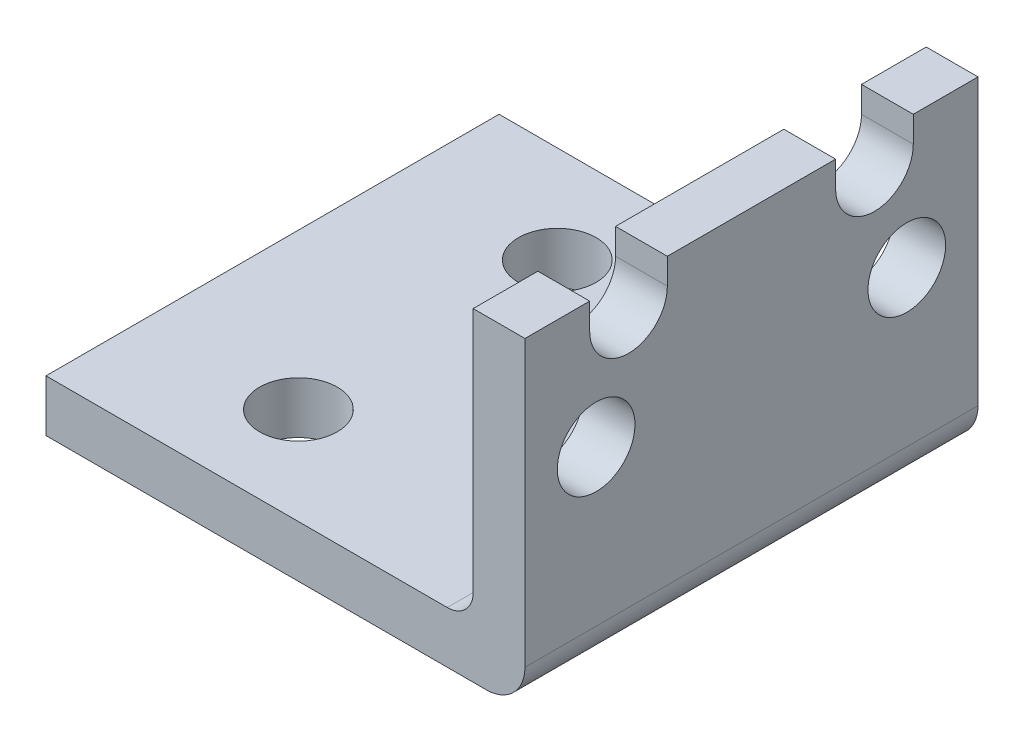
ISO-10303-21;
HEADER;
FILE_DESCRIPTION(('STEP AP214'),'2;1');
FILE_NAME('part.step','',(''),(''),'','','');
FILE_SCHEMA(('AUTOMOTIVE_DESIGN { 1 0 10303 214 1 1 1 1 }'));
ENDSEC;
DATA;
#1=APPLICATION_CONTEXT('core data for automotive mechanical design processes');
#2=APPLICATION_PROTOCOL_DEFINITION('international standard','automotive_design',2000,#1);
#3=PRODUCT_CONTEXT('',#1,'mechanical');
#4=PRODUCT('Part','Part','',(#3));
#5=PRODUCT_RELATED_PRODUCT_CATEGORY('part','',(#4));
#6=PRODUCT_DEFINITION_FORMATION('','',#4);
#7=PRODUCT_DEFINITION_CONTEXT('part definition',#1,'design');
#8=PRODUCT_DEFINITION('design','',#6,#7);
#9=PRODUCT_DEFINITION_SHAPE('','',#8);
#10=(LENGTH_UNIT() NAMED_UNIT(*) SI_UNIT(.MILLI.,.METRE.));
#11=(NAMED_UNIT(*) PLANE_ANGLE_UNIT() SI_UNIT($,.RADIAN.));
#12=(NAMED_UNIT(*) SI_UNIT($,.STERADIAN.) SOLID_ANGLE_UNIT());
#13=UNCERTAINTY_MEASURE_WITH_UNIT(LENGTH_MEASURE(1.E-05),#10,'distance_accuracy_value','');
#14=(GEOMETRIC_REPRESENTATION_CONTEXT(3) GLOBAL_UNCERTAINTY_ASSIGNED_CONTEXT((#13)) GLOBAL_UNIT_ASSIGNED_CONTEXT((#10,
#11,#12)) REPRESENTATION_CONTEXT('',''));
#15=CARTESIAN_POINT('',(0.,0.,0.));
#16=DIRECTION('',(0.,0.,1.));
#17=DIRECTION('',(1.,0.,0.));
#18=AXIS2_PLACEMENT_3D('',#15,#16,#17);
#19=CARTESIAN_POINT('',(11.4354193478474,-0.0792929292929359,35.));
#20=DIRECTION('',(0.,1.,0.));
#21=DIRECTION('',(0.,0.,1.));
#22=AXIS2_PLACEMENT_3D('',#19,#20,#21);
#23=PLANE('',#22);
#24=DIRECTION('',(-1.,0.,0.));
#25=VECTOR('',#24,1.);
#26=CARTESIAN_POINT('',(11.4354193478474,-0.0792929292929359,24.));
#27=LINE('',#26,#25);
#28=CARTESIAN_POINT('',(24.167628925166,-0.0792929292929359,24.));
#29=VERTEX_POINT('',#28);
#30=CARTESIAN_POINT('',(20.167628925166,-0.0792929292929359,24.));
#31=VERTEX_POINT('',#30);
#32=EDGE_CURVE('E194',#29,#31,#27,.T.);
#33=ORIENTED_EDGE('',*,*,#32,.F.);
#34=DIRECTION('',(0.,0.,-1.));
#35=VECTOR('',#34,1.);
#36=CARTESIAN_POINT('',(24.167628925166,-0.0792929292929359,35.));
#37=LINE('',#36,#35);
#38=CARTESIAN_POINT('',(24.167628925166,-0.0792929292929359,11.));
#39=VERTEX_POINT('',#38);
#40=EDGE_CURVE('E268',#29,#39,#37,.T.);
#41=ORIENTED_EDGE('',*,*,#40,.T.);
#42=DIRECTION('',(1.,0.,0.));
#43=VECTOR('',#42,1.);
#44=CARTESIAN_POINT('',(11.4354193478474,-0.0792929292929359,11.));
#45=LINE('',#44,#43);
#46=CARTESIAN_POINT('',(20.167628925166,-0.0792929292929359,11.));
#47=VERTEX_POINT('',#46);
#48=EDGE_CURVE('E196',#47,#39,#45,.T.);
#49=ORIENTED_EDGE('',*,*,#48,.F.);
#50=DIRECTION('',(0.,0.,-1.));
#51=VECTOR('',#50,1.);
#52=CARTESIAN_POINT('',(20.167628925166,-0.0792929292929359,35.));
#53=LINE('',#52,#51);
#54=EDGE_CURVE('E264',#31,#47,#53,.T.);
#55=ORIENTED_EDGE('',*,*,#54,.F.);
#56=EDGE_LOOP('',(#33,#41,#49,#55));
#57=FACE_BOUND('',#56,.T.);
#58=ADVANCED_FACE('F34',(#57),#23,.T.);
#59=DIRECTION('',(-1.,0.,0.));
#60=VECTOR('',#59,1.);
#61=CARTESIAN_POINT('',(11.4354193478474,-0.0792929292929359,5.));
#62=LINE('',#61,#60);
#63=CARTESIAN_POINT('',(24.167628925166,-0.0792929292929359,5.));
#64=VERTEX_POINT('',#63);
#65=CARTESIAN_POINT('',(20.167628925166,-0.0792929292929359,5.));
#66=VERTEX_POINT('',#65);
#67=EDGE_CURVE('E198',#64,#66,#62,.T.);
#68=ORIENTED_EDGE('',*,*,#67,.F.);
#69=CARTESIAN_POINT('',(24.167628925166,-0.0792929292929359,0.));
#70=VERTEX_POINT('',#69);
#71=EDGE_CURVE('E263',#64,#70,#37,.T.);
#72=ORIENTED_EDGE('',*,*,#71,.T.);
#73=DIRECTION('',(1.,0.,0.));
#74=VECTOR('',#73,1.);
#75=CARTESIAN_POINT('',(11.4354193478474,-0.0792929292929359,0.));
#76=LINE('',#75,#74);
#77=CARTESIAN_POINT('',(20.167628925166,-0.0792929292929359,0.));
#78=VERTEX_POINT('',#77);
#79=EDGE_CURVE('E253',#78,#70,#76,.T.);
#80=ORIENTED_EDGE('',*,*,#79,.F.);
#81=EDGE_CURVE('E259',#66,#78,#53,.T.);
#82=ORIENTED_EDGE('',*,*,#81,.F.);
#83=EDGE_LOOP('',(#68,#72,#80,#82));
#84=FACE_BOUND('',#83,.T.);
#85=ADVANCED_FACE('F317',(#84),#23,.T.);
#86=CARTESIAN_POINT('',(18.167628925166,-19.0792929292929,35.));
#87=DIRECTION('',(0.,0.,-1.));
#88=DIRECTION('',(-1.,0.,0.));
#89=AXIS2_PLACEMENT_3D('',#86,#87,#88);
#90=CYLINDRICAL_SURFACE('',#89,2.);
#91=CARTESIAN_POINT('',(18.167628925166,-19.0792929292929,0.));
#92=DIRECTION('',(0.,0.,1.));
#93=DIRECTION('',(1.,0.,0.));
#94=AXIS2_PLACEMENT_3D('',#91,#92,#93);
#95=CIRCLE('',#94,2.);
#96=CARTESIAN_POINT('',(18.167628925166,-21.0792929292929,0.));
#97=VERTEX_POINT('',#96);
#98=CARTESIAN_POINT('',(20.167628925166,-19.0792929292929,0.));
#99=VERTEX_POINT('',#98);
#100=EDGE_CURVE('E212',#97,#99,#95,.T.);
#101=ORIENTED_EDGE('',*,*,#100,.F.);
#102=DIRECTION('',(0.,0.,-1.));
#103=VECTOR('',#102,1.);
#104=CARTESIAN_POINT('',(18.167628925166,-21.0792929292929,35.));
#105=LINE('',#104,#103);
#106=CARTESIAN_POINT('',(18.167628925166,-21.0792929292929,35.));
#107=VERTEX_POINT('',#106);
#108=EDGE_CURVE('E276',#107,#97,#105,.T.);
#109=ORIENTED_EDGE('',*,*,#108,.F.);
#110=CARTESIAN_POINT('',(18.167628925166,-19.0792929292929,35.));
#111=DIRECTION('',(0.,0.,1.));
#112=DIRECTION('',(1.,0.,0.));
#113=AXIS2_PLACEMENT_3D('',#110,#111,#112);
#114=CIRCLE('',#113,2.);
#115=CARTESIAN_POINT('',(20.167628925166,-19.0792929292929,35.));
#116=VERTEX_POINT('',#115);
#117=EDGE_CURVE('E213',#107,#116,#114,.T.);
#118=ORIENTED_EDGE('',*,*,#117,.T.);
#119=DIRECTION('',(0.,0.,-1.));
#120=VECTOR('',#119,1.);
#121=CARTESIAN_POINT('',(20.167628925166,-19.0792929292929,35.));
#122=LINE('',#121,#120);
#123=EDGE_CURVE('E235',#116,#99,#122,.T.);
#124=ORIENTED_EDGE('',*,*,#123,.T.);
#125=EDGE_LOOP('',(#101,#109,#118,#124));
#126=FACE_BOUND('',#125,.T.);
#127=ADVANCED_FACE('F36',(#126),#90,.F.);
#128=CARTESIAN_POINT('',(11.4354193478474,-21.0792929292929,35.));
#129=DIRECTION('',(0.,-1.,0.));
#130=DIRECTION('',(1.,0.,0.));
#131=AXIS2_PLACEMENT_3D('',#128,#129,#130);
#132=PLANE('',#131);
#133=CARTESIAN_POINT('',(-0.832371074834004,-21.0792929292929,27.5));
#134=DIRECTION('',(0.,-1.,0.));
#135=DIRECTION('',(1.,0.,0.));
#136=AXIS2_PLACEMENT_3D('',#133,#134,#135);
#137=CIRCLE('',#136,3.);
#138=CARTESIAN_POINT('',(2.167628925166,-21.0792929292929,27.5));
#139=VERTEX_POINT('',#138);
#140=EDGE_CURVE('E203',#139,#139,#137,.T.);
#141=ORIENTED_EDGE('',*,*,#140,.T.);
#142=EDGE_LOOP('',(#141));
#143=FACE_BOUND('',#142,.T.);
#144=CARTESIAN_POINT('',(-0.832371074834001,-21.0792929292929,7.5));
#145=DIRECTION('',(0.,-1.,0.));
#146=DIRECTION('',(1.,0.,0.));
#147=AXIS2_PLACEMENT_3D('',#144,#145,#146);
#148=CIRCLE('',#147,3.);
#149=CARTESIAN_POINT('',(2.167628925166,-21.0792929292929,7.5));
#150=VERTEX_POINT('',#149);
#151=EDGE_CURVE('E209',#150,#150,#148,.T.);
#152=ORIENTED_EDGE('',*,*,#151,.T.);
#153=EDGE_LOOP('',(#152));
#154=FACE_BOUND('',#153,.T.);
#155=DIRECTION('',(-1.,0.,0.));
#156=VECTOR('',#155,1.);
#157=CARTESIAN_POINT('',(11.4354193478474,-21.0792929292929,0.));
#158=LINE('',#157,#156);
#159=CARTESIAN_POINT('',(-12.832371074834,-21.0792929292929,0.));
#160=VERTEX_POINT('',#159);
#161=EDGE_CURVE('E238',#97,#160,#158,.T.);
#162=ORIENTED_EDGE('',*,*,#161,.T.);
#163=DIRECTION('',(0.,0.,-1.));
#164=VECTOR('',#163,1.);
#165=CARTESIAN_POINT('',(-12.832371074834,-21.0792929292929,35.));
#166=LINE('',#165,#164);
#167=CARTESIAN_POINT('',(-12.832371074834,-21.0792929292929,35.));
#168=VERTEX_POINT('',#167);
#169=EDGE_CURVE('E274',#168,#160,#166,.T.);
#170=ORIENTED_EDGE('',*,*,#169,.F.);
#171=DIRECTION('',(-1.,0.,0.));
#172=VECTOR('',#171,1.);
#173=CARTESIAN_POINT('',(11.4354193478474,-21.0792929292929,35.));
#174=LINE('',#173,#172);
#175=EDGE_CURVE('E216',#107,#168,#174,.T.);
#176=ORIENTED_EDGE('',*,*,#175,.F.);
#177=ORIENTED_EDGE('',*,*,#108,.T.);
#178=EDGE_LOOP('',(#162,#170,#176,#177));
#179=FACE_BOUND('',#178,.T.);
#180=ADVANCED_FACE('F367',(#143,#154,#179),#132,.F.);
#181=CARTESIAN_POINT('',(-12.832371074834,-61.1764572046227,35.));
#182=DIRECTION('',(-1.,0.,0.));
#183=DIRECTION('',(0.,-1.,0.));
#184=AXIS2_PLACEMENT_3D('',#181,#182,#183);
#185=PLANE('',#184);
#186=DIRECTION('',(0.,1.,0.));
#187=VECTOR('',#186,1.);
#188=CARTESIAN_POINT('',(-12.832371074834,-61.1764572046227,0.));
#189=LINE('',#188,#187);
#190=CARTESIAN_POINT('',(-12.832371074834,-25.0792929292929,0.));
#191=VERTEX_POINT('',#190);
#192=EDGE_CURVE('E241',#191,#160,#189,.T.);
#193=ORIENTED_EDGE('',*,*,#192,.F.);
#194=DIRECTION('',(0.,0.,-1.));
#195=VECTOR('',#194,1.);
#196=CARTESIAN_POINT('',(-12.832371074834,-25.0792929292929,35.));
#197=LINE('',#196,#195);
#198=CARTESIAN_POINT('',(-12.832371074834,-25.0792929292929,35.));
#199=VERTEX_POINT('',#198);
#200=EDGE_CURVE('E272',#199,#191,#197,.T.);
#201=ORIENTED_EDGE('',*,*,#200,.F.);
#202=DIRECTION('',(0.,1.,0.));
#203=VECTOR('',#202,1.);
#204=CARTESIAN_POINT('',(-12.832371074834,-61.1764572046227,35.));
#205=LINE('',#204,#203);
#206=EDGE_CURVE('E219',#199,#168,#205,.T.);
#207=ORIENTED_EDGE('',*,*,#206,.T.);
#208=ORIENTED_EDGE('',*,*,#169,.T.);
#209=EDGE_LOOP('',(#193,#201,#207,#208));
#210=FACE_BOUND('',#209,.T.);
#211=ADVANCED_FACE('F364',(#210),#185,.T.);
#212=CARTESIAN_POINT('',(11.4354193478474,-25.0792929292929,35.));
#213=DIRECTION('',(0.,-1.,0.));
#214=DIRECTION('',(1.,0.,0.));
#215=AXIS2_PLACEMENT_3D('',#212,#213,#214);
#216=PLANE('',#215);
#217=CARTESIAN_POINT('',(-0.832371074834004,-25.0792929292929,27.5));
#218=DIRECTION('',(0.,-1.,0.));
#219=DIRECTION('',(1.,0.,0.));
#220=AXIS2_PLACEMENT_3D('',#217,#218,#219);
#221=CIRCLE('',#220,3.);
#222=CARTESIAN_POINT('',(2.167628925166,-25.0792929292929,27.5));
#223=VERTEX_POINT('',#222);
#224=EDGE_CURVE('E200',#223,#223,#221,.T.);
#225=ORIENTED_EDGE('',*,*,#224,.F.);
#226=EDGE_LOOP('',(#225));
#227=FACE_BOUND('',#226,.T.);
#228=CARTESIAN_POINT('',(-0.832371074834,-25.0792929292929,7.5));
#229=DIRECTION('',(0.,-1.,0.));
#230=DIRECTION('',(1.,0.,0.));
#231=AXIS2_PLACEMENT_3D('',#228,#229,#230);
#232=CIRCLE('',#231,3.);
#233=CARTESIAN_POINT('',(2.167628925166,-25.0792929292929,7.5));
#234=VERTEX_POINT('',#233);
#235=EDGE_CURVE('E206',#234,#234,#232,.T.);
#236=ORIENTED_EDGE('',*,*,#235,.F.);
#237=EDGE_LOOP('',(#236));
#238=FACE_BOUND('',#237,.T.);
#239=DIRECTION('',(-1.,0.,0.));
#240=VECTOR('',#239,1.);
#241=CARTESIAN_POINT('',(11.4354193478474,-25.0792929292929,0.));
#242=LINE('',#241,#240);
#243=CARTESIAN_POINT('',(21.167628925166,-25.0792929292929,0.));
#244=VERTEX_POINT('',#243);
#245=EDGE_CURVE('E244',#244,#191,#242,.T.);
#246=ORIENTED_EDGE('',*,*,#245,.F.);
#247=DIRECTION('',(0.,0.,-1.));
#248=VECTOR('',#247,1.);
#249=CARTESIAN_POINT('',(21.167628925166,-25.0792929292929,35.));
#250=LINE('',#249,#248);
#251=CARTESIAN_POINT('',(21.167628925166,-25.0792929292929,35.));
#252=VERTEX_POINT('',#251);
#253=EDGE_CURVE('E270',#252,#244,#250,.T.);
#254=ORIENTED_EDGE('',*,*,#253,.F.);
#255=DIRECTION('',(-1.,0.,0.));
#256=VECTOR('',#255,1.);
#257=CARTESIAN_POINT('',(11.4354193478474,-25.0792929292929,35.));
#258=LINE('',#257,#256);
#259=EDGE_CURVE('E222',#252,#199,#258,.T.);
#260=ORIENTED_EDGE('',*,*,#259,.T.);
#261=ORIENTED_EDGE('',*,*,#200,.T.);
#262=EDGE_LOOP('',(#246,#254,#260,#261));
#263=FACE_BOUND('',#262,.T.);
#264=ADVANCED_FACE('F359',(#227,#238,#263),#216,.T.);
#265=CARTESIAN_POINT('',(21.167628925166,-22.0792929292929,35.));
#266=DIRECTION('',(0.,0.,-1.));
#267=DIRECTION('',(-1.,0.,0.));
#268=AXIS2_PLACEMENT_3D('',#265,#266,#267);
#269=CYLINDRICAL_SURFACE('',#268,3.);
#270=CARTESIAN_POINT('',(21.167628925166,-22.0792929292929,0.));
#271=DIRECTION('',(0.,0.,1.));
#272=DIRECTION('',(1.,0.,0.));
#273=AXIS2_PLACEMENT_3D('',#270,#271,#272);
#274=CIRCLE('',#273,3.);
#275=CARTESIAN_POINT('',(24.167628925166,-22.0792929292929,0.));
#276=VERTEX_POINT('',#275);
#277=EDGE_CURVE('E247',#244,#276,#274,.T.);
#278=ORIENTED_EDGE('',*,*,#277,.T.);
#279=DIRECTION('',(0.,0.,-1.));
#280=VECTOR('',#279,1.);
#281=CARTESIAN_POINT('',(24.167628925166,-22.0792929292929,35.));
#282=LINE('',#281,#280);
#283=CARTESIAN_POINT('',(24.167628925166,-22.0792929292929,35.));
#284=VERTEX_POINT('',#283);
#285=EDGE_CURVE('E267',#284,#276,#282,.T.);
#286=ORIENTED_EDGE('',*,*,#285,.F.);
#287=CARTESIAN_POINT('',(21.167628925166,-22.0792929292929,35.));
#288=DIRECTION('',(0.,0.,1.));
#289=DIRECTION('',(1.,0.,0.));
#290=AXIS2_PLACEMENT_3D('',#287,#288,#289);
#291=CIRCLE('',#290,3.);
#292=EDGE_CURVE('E225',#252,#284,#291,.T.);
#293=ORIENTED_EDGE('',*,*,#292,.F.);
#294=ORIENTED_EDGE('',*,*,#253,.T.);
#295=EDGE_LOOP('',(#278,#286,#293,#294));
#296=FACE_BOUND('',#295,.T.);
#297=ADVANCED_FACE('F305',(#296),#269,.T.);
#298=CARTESIAN_POINT('',(24.167628925166,-61.1764572046227,35.));
#299=DIRECTION('',(1.,0.,0.));
#300=DIRECTION('',(0.,1.,0.));
#301=AXIS2_PLACEMENT_3D('',#298,#299,#300);
#302=PLANE('',#301);
#303=DIRECTION('',(0.,1.,0.));
#304=VECTOR('',#303,1.);
#305=CARTESIAN_POINT('',(24.167628925166,-2.07929292929293,24.));
#306=LINE('',#305,#304);
#307=CARTESIAN_POINT('',(24.167628925166,-2.07929292929293,24.));
#308=VERTEX_POINT('',#307);
#309=EDGE_CURVE('E154',#308,#29,#306,.T.);
#310=ORIENTED_EDGE('',*,*,#309,.F.);
#311=CARTESIAN_POINT('',(24.167628925166,-2.07929292929293,27.));
#312=DIRECTION('',(1.,0.,0.));
#313=DIRECTION('',(0.,1.,0.));
#314=AXIS2_PLACEMENT_3D('',#311,#312,#313);
#315=CIRCLE('',#314,3.);
#316=CARTESIAN_POINT('',(24.167628925166,-2.07929292929293,30.));
#317=VERTEX_POINT('',#316);
#318=EDGE_CURVE('E149',#317,#308,#315,.T.);
#319=ORIENTED_EDGE('',*,*,#318,.F.);
#320=DIRECTION('',(0.,-1.,0.));
#321=VECTOR('',#320,1.);
#322=CARTESIAN_POINT('',(24.167628925166,-2.07929292929293,30.));
#323=LINE('',#322,#321);
#324=CARTESIAN_POINT('',(24.167628925166,-0.0792929292929359,30.));
#325=VERTEX_POINT('',#324);
#326=EDGE_CURVE('E157',#325,#317,#323,.T.);
#327=ORIENTED_EDGE('',*,*,#326,.F.);
#328=CARTESIAN_POINT('',(24.167628925166,-0.0792929292929359,35.));
#329=VERTEX_POINT('',#328);
#330=EDGE_CURVE('E265',#329,#325,#37,.T.);
#331=ORIENTED_EDGE('',*,*,#330,.F.);
#332=DIRECTION('',(0.,-1.,0.));
#333=VECTOR('',#332,1.);
#334=CARTESIAN_POINT('',(24.167628925166,-61.1764572046227,35.));
#335=LINE('',#334,#333);
#336=EDGE_CURVE('E227',#329,#284,#335,.T.);
#337=ORIENTED_EDGE('',*,*,#336,.T.);
#338=ORIENTED_EDGE('',*,*,#285,.T.);
#339=DIRECTION('',(0.,-1.,0.));
#340=VECTOR('',#339,1.);
#341=CARTESIAN_POINT('',(24.167628925166,-61.1764572046227,0.));
#342=LINE('',#341,#340);
#343=EDGE_CURVE('E250',#70,#276,#342,.T.);
#344=ORIENTED_EDGE('',*,*,#343,.F.);
#345=ORIENTED_EDGE('',*,*,#71,.F.);
#346=DIRECTION('',(0.,1.,0.));
#347=VECTOR('',#346,1.);
#348=CARTESIAN_POINT('',(24.167628925166,-2.07929292929293,5.));
#349=LINE('',#348,#347);
#350=CARTESIAN_POINT('',(24.167628925166,-2.07929292929293,5.));
#351=VERTEX_POINT('',#350);
#352=EDGE_CURVE('E176',#351,#64,#349,.T.);
#353=ORIENTED_EDGE('',*,*,#352,.F.);
#354=CARTESIAN_POINT('',(24.167628925166,-2.07929292929293,8.));
#355=DIRECTION('',(1.,0.,0.));
#356=DIRECTION('',(0.,1.,0.));
#357=AXIS2_PLACEMENT_3D('',#354,#355,#356);
#358=CIRCLE('',#357,3.);
#359=CARTESIAN_POINT('',(24.167628925166,-2.07929292929293,11.));
#360=VERTEX_POINT('',#359);
#361=EDGE_CURVE('E173',#360,#351,#358,.T.);
#362=ORIENTED_EDGE('',*,*,#361,.F.);
#363=DIRECTION('',(0.,-1.,0.));
#364=VECTOR('',#363,1.);
#365=CARTESIAN_POINT('',(24.167628925166,-2.07929292929293,11.));
#366=LINE('',#365,#364);
#367=EDGE_CURVE('E170',#39,#360,#366,.T.);
#368=ORIENTED_EDGE('',*,*,#367,.F.);
#369=ORIENTED_EDGE('',*,*,#40,.F.);
#370=EDGE_LOOP('',(#310,#319,#327,#331,#337,#338,#344,#345,#353,#362,#368,#369));
#371=FACE_BOUND('',#370,.T.);
#372=CARTESIAN_POINT('',(24.167628925166,-10.0792929292929,29.5));
#373=DIRECTION('',(1.,0.,0.));
#374=DIRECTION('',(0.,1.,0.));
#375=AXIS2_PLACEMENT_3D('',#372,#373,#374);
#376=CIRCLE('',#375,3.);
#377=CARTESIAN_POINT('',(24.167628925166,-7.07929292929292,29.5));
#378=VERTEX_POINT('',#377);
#379=EDGE_CURVE('E180',#378,#378,#376,.T.);
#380=ORIENTED_EDGE('',*,*,#379,.F.);
#381=EDGE_LOOP('',(#380));
#382=FACE_BOUND('',#381,.T.);
#383=CARTESIAN_POINT('',(24.167628925166,-10.0792929292929,5.50000000000001));
#384=DIRECTION('',(1.,0.,0.));
#385=DIRECTION('',(0.,1.,0.));
#386=AXIS2_PLACEMENT_3D('',#383,#384,#385);
#387=CIRCLE('',#386,3.);
#388=CARTESIAN_POINT('',(24.167628925166,-7.07929292929292,5.50000000000001));
#389=VERTEX_POINT('',#388);
#390=EDGE_CURVE('E187',#389,#389,#387,.T.);
#391=ORIENTED_EDGE('',*,*,#390,.F.);
#392=EDGE_LOOP('',(#391));
#393=FACE_BOUND('',#392,.T.);
#394=ADVANCED_FACE('F164',(#371,#382,#393),#302,.T.);
#395=DIRECTION('',(1.,0.,0.));
#396=VECTOR('',#395,1.);
#397=CARTESIAN_POINT('',(11.4354193478474,-0.0792929292929359,30.));
#398=LINE('',#397,#396);
#399=CARTESIAN_POINT('',(20.167628925166,-0.0792929292929359,30.));
#400=VERTEX_POINT('',#399);
#401=EDGE_CURVE('E160',#400,#325,#398,.T.);
#402=ORIENTED_EDGE('',*,*,#401,.F.);
#403=CARTESIAN_POINT('',(20.167628925166,-0.0792929292929359,35.));
#404=VERTEX_POINT('',#403);
#405=EDGE_CURVE('E260',#404,#400,#53,.T.);
#406=ORIENTED_EDGE('',*,*,#405,.F.);
#407=DIRECTION('',(1.,0.,0.));
#408=VECTOR('',#407,1.);
#409=CARTESIAN_POINT('',(11.4354193478474,-0.0792929292929359,35.));
#410=LINE('',#409,#408);
#411=EDGE_CURVE('E230',#404,#329,#410,.T.);
#412=ORIENTED_EDGE('',*,*,#411,.T.);
#413=ORIENTED_EDGE('',*,*,#330,.T.);
#414=EDGE_LOOP('',(#402,#406,#412,#413));
#415=FACE_BOUND('',#414,.T.);
#416=ADVANCED_FACE('F294',(#415),#23,.T.);
#417=CARTESIAN_POINT('',(20.167628925166,-61.1764572046227,35.));
#418=DIRECTION('',(1.,0.,0.));
#419=DIRECTION('',(0.,1.,0.));
#420=AXIS2_PLACEMENT_3D('',#417,#418,#419);
#421=PLANE('',#420);
#422=CARTESIAN_POINT('',(20.167628925166,-10.0792929292929,29.5));
#423=DIRECTION('',(1.,0.,0.));
#424=DIRECTION('',(0.,1.,0.));
#425=AXIS2_PLACEMENT_3D('',#422,#423,#424);
#426=CIRCLE('',#425,3.);
#427=CARTESIAN_POINT('',(20.167628925166,-7.07929292929292,29.5));
#428=VERTEX_POINT('',#427);
#429=EDGE_CURVE('E184',#428,#428,#426,.T.);
#430=ORIENTED_EDGE('',*,*,#429,.T.);
#431=EDGE_LOOP('',(#430));
#432=FACE_BOUND('',#431,.T.);
#433=CARTESIAN_POINT('',(20.167628925166,-10.0792929292929,5.50000000000001));
#434=DIRECTION('',(1.,0.,0.));
#435=DIRECTION('',(0.,1.,0.));
#436=AXIS2_PLACEMENT_3D('',#433,#434,#435);
#437=CIRCLE('',#436,3.);
#438=CARTESIAN_POINT('',(20.167628925166,-7.07929292929292,5.50000000000001));
#439=VERTEX_POINT('',#438);
#440=EDGE_CURVE('E190',#439,#439,#437,.T.);
#441=ORIENTED_EDGE('',*,*,#440,.T.);
#442=EDGE_LOOP('',(#441));
#443=FACE_BOUND('',#442,.T.);
#444=CARTESIAN_POINT('',(20.167628925166,-2.07929292929294,27.));
#445=DIRECTION('',(1.,0.,0.));
#446=DIRECTION('',(0.,1.,0.));
#447=AXIS2_PLACEMENT_3D('',#444,#445,#446);
#448=CIRCLE('',#447,3.);
#449=CARTESIAN_POINT('',(20.167628925166,-2.07929292929295,30.));
#450=VERTEX_POINT('',#449);
#451=CARTESIAN_POINT('',(20.167628925166,-2.07929292929294,24.));
#452=VERTEX_POINT('',#451);
#453=EDGE_CURVE('E42',#450,#452,#448,.T.);
#454=ORIENTED_EDGE('',*,*,#453,.T.);
#455=DIRECTION('',(0.,1.,0.));
#456=VECTOR('',#455,1.);
#457=CARTESIAN_POINT('',(20.167628925166,-61.1764572046227,24.));
#458=LINE('',#457,#456);
#459=EDGE_CURVE('E11',#452,#31,#458,.T.);
#460=ORIENTED_EDGE('',*,*,#459,.T.);
#461=ORIENTED_EDGE('',*,*,#54,.T.);
#462=DIRECTION('',(0.,-1.,0.));
#463=VECTOR('',#462,1.);
#464=CARTESIAN_POINT('',(20.167628925166,-61.1764572046227,11.));
#465=LINE('',#464,#463);
#466=CARTESIAN_POINT('',(20.167628925166,-2.07929292929295,11.));
#467=VERTEX_POINT('',#466);
#468=EDGE_CURVE('E278',#47,#467,#465,.T.);
#469=ORIENTED_EDGE('',*,*,#468,.T.);
#470=CARTESIAN_POINT('',(20.167628925166,-2.07929292929294,8.));
#471=DIRECTION('',(1.,0.,0.));
#472=DIRECTION('',(0.,1.,0.));
#473=AXIS2_PLACEMENT_3D('',#470,#471,#472);
#474=CIRCLE('',#473,3.);
#475=CARTESIAN_POINT('',(20.167628925166,-2.07929292929294,5.));
#476=VERTEX_POINT('',#475);
#477=EDGE_CURVE('E281',#467,#476,#474,.T.);
#478=ORIENTED_EDGE('',*,*,#477,.T.);
#479=DIRECTION('',(0.,1.,0.));
#480=VECTOR('',#479,1.);
#481=CARTESIAN_POINT('',(20.167628925166,-61.1764572046227,5.));
#482=LINE('',#481,#480);
#483=EDGE_CURVE('E284',#476,#66,#482,.T.);
#484=ORIENTED_EDGE('',*,*,#483,.T.);
#485=ORIENTED_EDGE('',*,*,#81,.T.);
#486=DIRECTION('',(0.,-1.,0.));
#487=VECTOR('',#486,1.);
#488=CARTESIAN_POINT('',(20.167628925166,-61.1764572046227,0.));
#489=LINE('',#488,#487);
#490=EDGE_CURVE('E217',#78,#99,#489,.T.);
#491=ORIENTED_EDGE('',*,*,#490,.T.);
#492=ORIENTED_EDGE('',*,*,#123,.F.);
#493=DIRECTION('',(0.,-1.,0.));
#494=VECTOR('',#493,1.);
#495=CARTESIAN_POINT('',(20.167628925166,-61.1764572046227,35.));
#496=LINE('',#495,#494);
#497=EDGE_CURVE('E233',#404,#116,#496,.T.);
#498=ORIENTED_EDGE('',*,*,#497,.F.);
#499=ORIENTED_EDGE('',*,*,#405,.T.);
#500=DIRECTION('',(0.,-1.,0.));
#501=VECTOR('',#500,1.);
#502=CARTESIAN_POINT('',(20.167628925166,-61.1764572046227,30.));
#503=LINE('',#502,#501);
#504=EDGE_CURVE('E287',#400,#450,#503,.T.);
#505=ORIENTED_EDGE('',*,*,#504,.T.);
#506=EDGE_LOOP('',(#454,#460,#461,#469,#478,#484,#485,#491,#492,#498,#499,#505));
#507=FACE_BOUND('',#506,.T.);
#508=ADVANCED_FACE('F289',(#432,#443,#507),#421,.F.);
#509=CARTESIAN_POINT('',(11.4354193478474,-61.1764572046227,35.));
#510=DIRECTION('',(0.,0.,1.));
#511=DIRECTION('',(1.,0.,0.));
#512=AXIS2_PLACEMENT_3D('',#509,#510,#511);
#513=PLANE('',#512);
#514=ORIENTED_EDGE('',*,*,#117,.F.);
#515=ORIENTED_EDGE('',*,*,#175,.T.);
#516=ORIENTED_EDGE('',*,*,#206,.F.);
#517=ORIENTED_EDGE('',*,*,#259,.F.);
#518=ORIENTED_EDGE('',*,*,#292,.T.);
#519=ORIENTED_EDGE('',*,*,#336,.F.);
#520=ORIENTED_EDGE('',*,*,#411,.F.);
#521=ORIENTED_EDGE('',*,*,#497,.T.);
#522=EDGE_LOOP('',(#514,#515,#516,#517,#518,#519,#520,#521));
#523=FACE_BOUND('',#522,.T.);
#524=ADVANCED_FACE('F299',(#523),#513,.T.);
#525=CARTESIAN_POINT('',(11.4354193478474,-61.1764572046227,0.));
#526=DIRECTION('',(0.,0.,1.));
#527=DIRECTION('',(1.,0.,0.));
#528=AXIS2_PLACEMENT_3D('',#525,#526,#527);
#529=PLANE('',#528);
#530=ORIENTED_EDGE('',*,*,#100,.T.);
#531=ORIENTED_EDGE('',*,*,#490,.F.);
#532=ORIENTED_EDGE('',*,*,#79,.T.);
#533=ORIENTED_EDGE('',*,*,#343,.T.);
#534=ORIENTED_EDGE('',*,*,#277,.F.);
#535=ORIENTED_EDGE('',*,*,#245,.T.);
#536=ORIENTED_EDGE('',*,*,#192,.T.);
#537=ORIENTED_EDGE('',*,*,#161,.F.);
#538=EDGE_LOOP('',(#530,#531,#532,#533,#534,#535,#536,#537));
#539=FACE_BOUND('',#538,.T.);
#540=ADVANCED_FACE('F313',(#539),#529,.F.);
#541=CARTESIAN_POINT('',(-0.832371074834003,9.92070707070706,7.5));
#542=DIRECTION('',(0.,-1.,0.));
#543=DIRECTION('',(1.,0.,0.));
#544=AXIS2_PLACEMENT_3D('',#541,#542,#543);
#545=CYLINDRICAL_SURFACE('',#544,3.);
#546=ORIENTED_EDGE('',*,*,#235,.T.);
#547=EDGE_LOOP('',(#546));
#548=FACE_BOUND('',#547,.T.);
#549=ORIENTED_EDGE('',*,*,#151,.F.);
#550=EDGE_LOOP('',(#549));
#551=FACE_BOUND('',#550,.T.);
#552=ADVANCED_FACE('F387',(#548,#551),#545,.F.);
#553=CARTESIAN_POINT('',(-0.832371074834006,9.92070707070706,27.5));
#554=DIRECTION('',(0.,-1.,0.));
#555=DIRECTION('',(1.,0.,0.));
#556=AXIS2_PLACEMENT_3D('',#553,#554,#555);
#557=CYLINDRICAL_SURFACE('',#556,3.);
#558=ORIENTED_EDGE('',*,*,#224,.T.);
#559=EDGE_LOOP('',(#558));
#560=FACE_BOUND('',#559,.T.);
#561=ORIENTED_EDGE('',*,*,#140,.F.);
#562=EDGE_LOOP('',(#561));
#563=FACE_BOUND('',#562,.T.);
#564=ADVANCED_FACE('F389',(#560,#563),#557,.F.);
#565=CARTESIAN_POINT('',(-12.832371074834,-10.0792929292929,5.50000000000001));
#566=DIRECTION('',(1.,0.,0.));
#567=DIRECTION('',(0.,1.,0.));
#568=AXIS2_PLACEMENT_3D('',#565,#566,#567);
#569=CYLINDRICAL_SURFACE('',#568,3.);
#570=ORIENTED_EDGE('',*,*,#390,.T.);
#571=EDGE_LOOP('',(#570));
#572=FACE_BOUND('',#571,.T.);
#573=ORIENTED_EDGE('',*,*,#440,.F.);
#574=EDGE_LOOP('',(#573));
#575=FACE_BOUND('',#574,.T.);
#576=ADVANCED_FACE('F339',(#572,#575),#569,.F.);
#577=CARTESIAN_POINT('',(-12.832371074834,-10.0792929292929,29.5));
#578=DIRECTION('',(1.,0.,0.));
#579=DIRECTION('',(0.,1.,0.));
#580=AXIS2_PLACEMENT_3D('',#577,#578,#579);
#581=CYLINDRICAL_SURFACE('',#580,3.);
#582=ORIENTED_EDGE('',*,*,#379,.T.);
#583=EDGE_LOOP('',(#582));
#584=FACE_BOUND('',#583,.T.);
#585=ORIENTED_EDGE('',*,*,#429,.F.);
#586=EDGE_LOOP('',(#585));
#587=FACE_BOUND('',#586,.T.);
#588=ADVANCED_FACE('F332',(#584,#587),#581,.F.);
#589=CARTESIAN_POINT('',(-12.832371074834,-2.07929292929295,8.));
#590=DIRECTION('',(1.,0.,0.));
#591=DIRECTION('',(0.,1.,0.));
#592=AXIS2_PLACEMENT_3D('',#589,#590,#591);
#593=CYLINDRICAL_SURFACE('',#592,3.);
#594=DIRECTION('',(1.,0.,0.));
#595=VECTOR('',#594,1.);
#596=CARTESIAN_POINT('',(-12.832371074834,-2.07929292929295,11.));
#597=LINE('',#596,#595);
#598=EDGE_CURVE('E57',#467,#360,#597,.T.);
#599=ORIENTED_EDGE('',*,*,#598,.T.);
#600=ORIENTED_EDGE('',*,*,#361,.T.);
#601=DIRECTION('',(1.,0.,0.));
#602=VECTOR('',#601,1.);
#603=CARTESIAN_POINT('',(-12.832371074834,-2.07929292929295,5.));
#604=LINE('',#603,#602);
#605=EDGE_CURVE('E178',#476,#351,#604,.T.);
#606=ORIENTED_EDGE('',*,*,#605,.F.);
#607=ORIENTED_EDGE('',*,*,#477,.F.);
#608=EDGE_LOOP('',(#599,#600,#606,#607));
#609=FACE_BOUND('',#608,.T.);
#610=ADVANCED_FACE('F330',(#609),#593,.F.);
#611=CARTESIAN_POINT('',(-12.832371074834,-2.07929292929295,5.));
#612=DIRECTION('',(0.,0.,-1.));
#613=DIRECTION('',(-1.,0.,0.));
#614=AXIS2_PLACEMENT_3D('',#611,#612,#613);
#615=PLANE('',#614);
#616=ORIENTED_EDGE('',*,*,#67,.T.);
#617=ORIENTED_EDGE('',*,*,#483,.F.);
#618=ORIENTED_EDGE('',*,*,#605,.T.);
#619=ORIENTED_EDGE('',*,*,#352,.T.);
#620=EDGE_LOOP('',(#616,#617,#618,#619));
#621=FACE_BOUND('',#620,.T.);
#622=ADVANCED_FACE('F328',(#621),#615,.F.);
#623=CARTESIAN_POINT('',(-12.832371074834,-2.07929292929295,11.));
#624=DIRECTION('',(0.,0.,1.));
#625=DIRECTION('',(1.,0.,0.));
#626=AXIS2_PLACEMENT_3D('',#623,#624,#625);
#627=PLANE('',#626);
#628=ORIENTED_EDGE('',*,*,#48,.T.);
#629=ORIENTED_EDGE('',*,*,#367,.T.);
#630=ORIENTED_EDGE('',*,*,#598,.F.);
#631=ORIENTED_EDGE('',*,*,#468,.F.);
#632=EDGE_LOOP('',(#628,#629,#630,#631));
#633=FACE_BOUND('',#632,.T.);
#634=ADVANCED_FACE('F324',(#633),#627,.F.);
#635=CARTESIAN_POINT('',(-12.832371074834,-2.07929292929295,27.));
#636=DIRECTION('',(1.,0.,0.));
#637=DIRECTION('',(0.,1.,0.));
#638=AXIS2_PLACEMENT_3D('',#635,#636,#637);
#639=CYLINDRICAL_SURFACE('',#638,3.);
#640=DIRECTION('',(1.,0.,0.));
#641=VECTOR('',#640,1.);
#642=CARTESIAN_POINT('',(-12.832371074834,-2.07929292929295,30.));
#643=LINE('',#642,#641);
#644=EDGE_CURVE('E49',#450,#317,#643,.T.);
#645=ORIENTED_EDGE('',*,*,#644,.T.);
#646=ORIENTED_EDGE('',*,*,#318,.T.);
#647=DIRECTION('',(1.,0.,0.));
#648=VECTOR('',#647,1.);
#649=CARTESIAN_POINT('',(-12.832371074834,-2.07929292929295,24.));
#650=LINE('',#649,#648);
#651=EDGE_CURVE('E153',#452,#308,#650,.T.);
#652=ORIENTED_EDGE('',*,*,#651,.F.);
#653=ORIENTED_EDGE('',*,*,#453,.F.);
#654=EDGE_LOOP('',(#645,#646,#652,#653));
#655=FACE_BOUND('',#654,.T.);
#656=ADVANCED_FACE('F146',(#655),#639,.F.);
#657=CARTESIAN_POINT('',(-12.832371074834,-2.07929292929295,24.));
#658=DIRECTION('',(0.,0.,-1.));
#659=DIRECTION('',(-1.,0.,0.));
#660=AXIS2_PLACEMENT_3D('',#657,#658,#659);
#661=PLANE('',#660);
#662=ORIENTED_EDGE('',*,*,#32,.T.);
#663=ORIENTED_EDGE('',*,*,#459,.F.);
#664=ORIENTED_EDGE('',*,*,#651,.T.);
#665=ORIENTED_EDGE('',*,*,#309,.T.);
#666=EDGE_LOOP('',(#662,#663,#664,#665));
#667=FACE_BOUND('',#666,.T.);
#668=ADVANCED_FACE('F498',(#667),#661,.F.);
#669=CARTESIAN_POINT('',(-12.832371074834,-2.07929292929295,30.));
#670=DIRECTION('',(0.,0.,1.));
#671=DIRECTION('',(1.,0.,0.));
#672=AXIS2_PLACEMENT_3D('',#669,#670,#671);
#673=PLANE('',#672);
#674=ORIENTED_EDGE('',*,*,#401,.T.);
#675=ORIENTED_EDGE('',*,*,#326,.T.);
#676=ORIENTED_EDGE('',*,*,#644,.F.);
#677=ORIENTED_EDGE('',*,*,#504,.F.);
#678=EDGE_LOOP('',(#674,#675,#676,#677));
#679=FACE_BOUND('',#678,.T.);
#680=ADVANCED_FACE('F158',(#679),#673,.F.);
#681=CLOSED_SHELL('',(#58,#85,#127,#180,#211,#264,#297,#394,#416,#508,#524,#540,#552,#564,#576,
#588,#610,#622,#634,#656,#668,#680));
#682=MANIFOLD_SOLID_BREP('B2',#681);
#683=ADVANCED_BREP_SHAPE_REPRESENTATION('',(#18,#682),#14);
#684=SHAPE_DEFINITION_REPRESENTATION(#9,#683);
ENDSEC;
END-ISO-10303-21;
